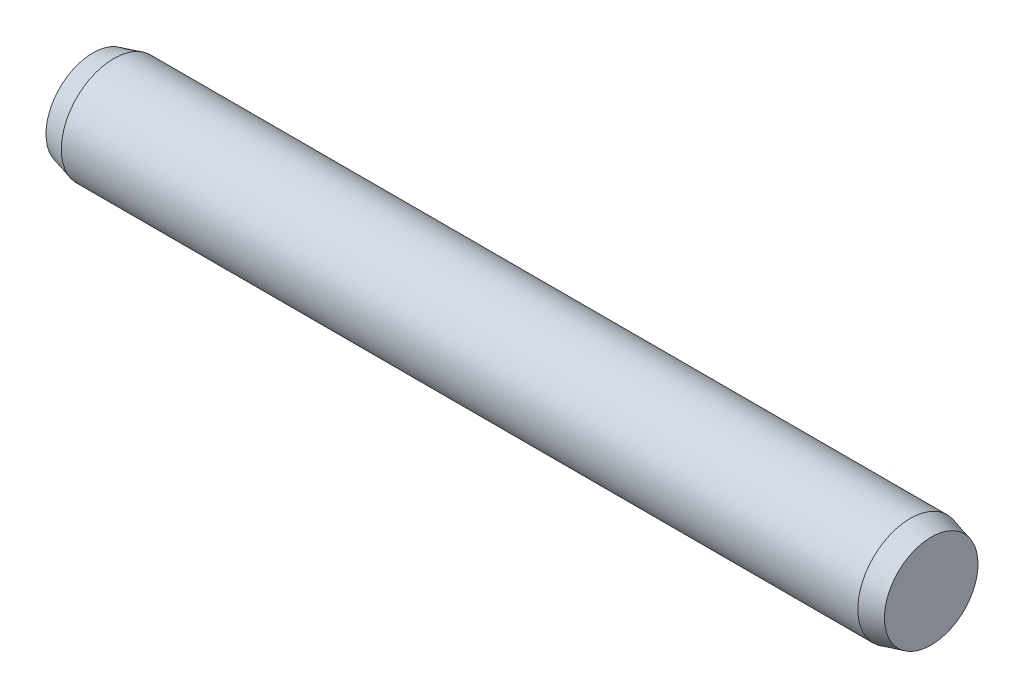
ISO-10303-21;
HEADER;
FILE_DESCRIPTION(('STEP AP214'),'2;1');
FILE_NAME('part.step','',(''),(''),'','','');
FILE_SCHEMA(('AUTOMOTIVE_DESIGN { 1 0 10303 214 1 1 1 1 }'));
ENDSEC;
DATA;
#1=APPLICATION_CONTEXT('core data for automotive mechanical design processes');
#2=APPLICATION_PROTOCOL_DEFINITION('international standard','automotive_design',2000,#1);
#3=PRODUCT_CONTEXT('',#1,'mechanical');
#4=PRODUCT('Part','Part','',(#3));
#5=PRODUCT_RELATED_PRODUCT_CATEGORY('part','',(#4));
#6=PRODUCT_DEFINITION_FORMATION('','',#4);
#7=PRODUCT_DEFINITION_CONTEXT('part definition',#1,'design');
#8=PRODUCT_DEFINITION('design','',#6,#7);
#9=PRODUCT_DEFINITION_SHAPE('','',#8);
#10=(LENGTH_UNIT() NAMED_UNIT(*) SI_UNIT(.MILLI.,.METRE.));
#11=(NAMED_UNIT(*) PLANE_ANGLE_UNIT() SI_UNIT($,.RADIAN.));
#12=(NAMED_UNIT(*) SI_UNIT($,.STERADIAN.) SOLID_ANGLE_UNIT());
#13=UNCERTAINTY_MEASURE_WITH_UNIT(LENGTH_MEASURE(1.E-05),#10,'distance_accuracy_value','');
#14=(GEOMETRIC_REPRESENTATION_CONTEXT(3) GLOBAL_UNCERTAINTY_ASSIGNED_CONTEXT((#13)) GLOBAL_UNIT_ASSIGNED_CONTEXT((#10,
#11,#12)) REPRESENTATION_CONTEXT('',''));
#15=CARTESIAN_POINT('',(0.,0.,0.));
#16=DIRECTION('',(0.,0.,1.));
#17=DIRECTION('',(1.,0.,0.));
#18=AXIS2_PLACEMENT_3D('',#15,#16,#17);
#19=CARTESIAN_POINT('',(-5.7,0.,0.));
#20=DIRECTION('',(1.,0.,0.));
#21=DIRECTION('',(0.,0.,-1.));
#22=AXIS2_PLACEMENT_3D('',#19,#20,#21);
#23=CYLINDRICAL_SURFACE('',#22,0.75);
#24=CARTESIAN_POINT('',(-5.7,0.,0.));
#25=DIRECTION('',(-1.,0.,0.));
#26=DIRECTION('',(0.,0.,1.));
#27=AXIS2_PLACEMENT_3D('',#24,#25,#26);
#28=CIRCLE('',#27,0.75);
#29=CARTESIAN_POINT('',(-5.7,0.,0.75));
#30=VERTEX_POINT('',#29);
#31=EDGE_CURVE('E46',#30,#30,#28,.T.);
#32=ORIENTED_EDGE('',*,*,#31,.F.);
#33=EDGE_LOOP('',(#32));
#34=FACE_BOUND('',#33,.T.);
#35=CARTESIAN_POINT('',(5.7,0.,0.));
#36=DIRECTION('',(1.,0.,0.));
#37=DIRECTION('',(0.,0.,-1.));
#38=AXIS2_PLACEMENT_3D('',#35,#36,#37);
#39=CIRCLE('',#38,0.75);
#40=CARTESIAN_POINT('',(5.7,0.,-0.75));
#41=VERTEX_POINT('',#40);
#42=EDGE_CURVE('E10',#41,#41,#39,.T.);
#43=ORIENTED_EDGE('',*,*,#42,.F.);
#44=EDGE_LOOP('',(#43));
#45=FACE_BOUND('',#44,.T.);
#46=ADVANCED_FACE('F32',(#34,#45),#23,.T.);
#47=CARTESIAN_POINT('',(5.7,0.,0.));
#48=DIRECTION('',(-1.,0.,0.));
#49=DIRECTION('',(0.,0.,-1.));
#50=AXIS2_PLACEMENT_3D('',#47,#48,#49);
#51=CONICAL_SURFACE('',#50,0.75,0.26179938779915);
#52=CARTESIAN_POINT('',(6.,0.,0.));
#53=DIRECTION('',(1.,0.,0.));
#54=DIRECTION('',(0.,0.,-1.));
#55=AXIS2_PLACEMENT_3D('',#52,#53,#54);
#56=CIRCLE('',#55,0.669615242270663);
#57=CARTESIAN_POINT('',(6.,0.,-0.669615242270663));
#58=VERTEX_POINT('',#57);
#59=EDGE_CURVE('E38',#58,#58,#56,.T.);
#60=ORIENTED_EDGE('',*,*,#59,.F.);
#61=EDGE_LOOP('',(#60));
#62=FACE_BOUND('',#61,.T.);
#63=ORIENTED_EDGE('',*,*,#42,.T.);
#64=EDGE_LOOP('',(#63));
#65=FACE_BOUND('',#64,.T.);
#66=ADVANCED_FACE('F56',(#62,#65),#51,.T.);
#67=CARTESIAN_POINT('',(6.,0.,0.));
#68=DIRECTION('',(1.,0.,0.));
#69=DIRECTION('',(0.,0.,-1.));
#70=AXIS2_PLACEMENT_3D('',#67,#68,#69);
#71=PLANE('',#70);
#72=ORIENTED_EDGE('',*,*,#59,.T.);
#73=EDGE_LOOP('',(#72));
#74=FACE_BOUND('',#73,.T.);
#75=ADVANCED_FACE('F60',(#74),#71,.T.);
#76=CARTESIAN_POINT('',(-5.7,0.,0.));
#77=DIRECTION('',(1.,0.,0.));
#78=DIRECTION('',(0.,0.,1.));
#79=AXIS2_PLACEMENT_3D('',#76,#77,#78);
#80=CONICAL_SURFACE('',#79,0.75,0.26179938779915);
#81=CARTESIAN_POINT('',(-6.,0.,0.));
#82=DIRECTION('',(-1.,0.,0.));
#83=DIRECTION('',(0.,0.,1.));
#84=AXIS2_PLACEMENT_3D('',#81,#82,#83);
#85=CIRCLE('',#84,0.669615242270663);
#86=CARTESIAN_POINT('',(-6.,0.,0.669615242270663));
#87=VERTEX_POINT('',#86);
#88=EDGE_CURVE('E42',#87,#87,#85,.T.);
#89=ORIENTED_EDGE('',*,*,#88,.F.);
#90=EDGE_LOOP('',(#89));
#91=FACE_BOUND('',#90,.T.);
#92=ORIENTED_EDGE('',*,*,#31,.T.);
#93=EDGE_LOOP('',(#92));
#94=FACE_BOUND('',#93,.T.);
#95=ADVANCED_FACE('F52',(#91,#94),#80,.T.);
#96=CARTESIAN_POINT('',(-6.,0.,0.));
#97=DIRECTION('',(-1.,0.,0.));
#98=DIRECTION('',(0.,0.,1.));
#99=AXIS2_PLACEMENT_3D('',#96,#97,#98);
#100=PLANE('',#99);
#101=ORIENTED_EDGE('',*,*,#88,.T.);
#102=EDGE_LOOP('',(#101));
#103=FACE_BOUND('',#102,.T.);
#104=ADVANCED_FACE('F69',(#103),#100,.T.);
#105=CLOSED_SHELL('',(#46,#66,#75,#95,#104));
#106=MANIFOLD_SOLID_BREP('B2',#105);
#107=ADVANCED_BREP_SHAPE_REPRESENTATION('',(#18,#106),#14);
#108=SHAPE_DEFINITION_REPRESENTATION(#9,#107);
ENDSEC;
END-ISO-10303-21;
